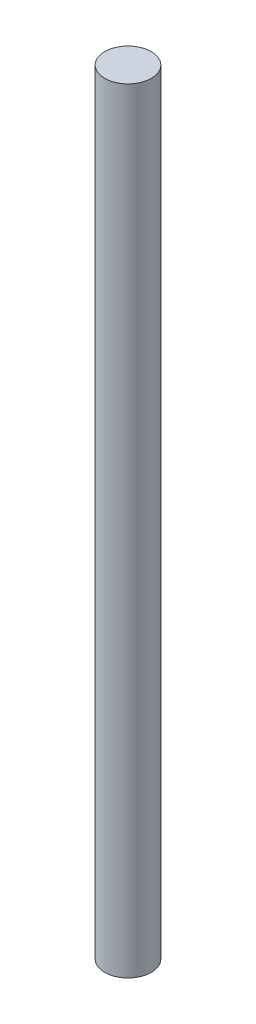
ISO-10303-21;
HEADER;
FILE_DESCRIPTION(('STEP AP214'),'2;1');
FILE_NAME('part.step','',(''),(''),'','','');
FILE_SCHEMA(('AUTOMOTIVE_DESIGN { 1 0 10303 214 1 1 1 1 }'));
ENDSEC;
DATA;
#1=APPLICATION_CONTEXT('core data for automotive mechanical design processes');
#2=APPLICATION_PROTOCOL_DEFINITION('international standard','automotive_design',2000,#1);
#3=PRODUCT_CONTEXT('',#1,'mechanical');
#4=PRODUCT('Part','Part','',(#3));
#5=PRODUCT_RELATED_PRODUCT_CATEGORY('part','',(#4));
#6=PRODUCT_DEFINITION_FORMATION('','',#4);
#7=PRODUCT_DEFINITION_CONTEXT('part definition',#1,'design');
#8=PRODUCT_DEFINITION('design','',#6,#7);
#9=PRODUCT_DEFINITION_SHAPE('','',#8);
#10=(LENGTH_UNIT() NAMED_UNIT(*) SI_UNIT(.MILLI.,.METRE.));
#11=(NAMED_UNIT(*) PLANE_ANGLE_UNIT() SI_UNIT($,.RADIAN.));
#12=(NAMED_UNIT(*) SI_UNIT($,.STERADIAN.) SOLID_ANGLE_UNIT());
#13=UNCERTAINTY_MEASURE_WITH_UNIT(LENGTH_MEASURE(1.E-05),#10,'distance_accuracy_value','');
#14=(GEOMETRIC_REPRESENTATION_CONTEXT(3) GLOBAL_UNCERTAINTY_ASSIGNED_CONTEXT((#13)) GLOBAL_UNIT_ASSIGNED_CONTEXT((#10,
#11,#12)) REPRESENTATION_CONTEXT('',''));
#15=CARTESIAN_POINT('',(0.,0.,0.));
#16=DIRECTION('',(0.,0.,1.));
#17=DIRECTION('',(1.,0.,0.));
#18=AXIS2_PLACEMENT_3D('',#15,#16,#17);
#19=CARTESIAN_POINT('',(0.,200.,0.));
#20=DIRECTION('',(0.,-1.,0.));
#21=DIRECTION('',(0.,0.,-1.));
#22=AXIS2_PLACEMENT_3D('',#19,#20,#21);
#23=CYLINDRICAL_SURFACE('',#22,6.);
#24=CARTESIAN_POINT('',(0.,200.,0.));
#25=DIRECTION('',(0.,1.,0.));
#26=DIRECTION('',(0.,0.,1.));
#27=AXIS2_PLACEMENT_3D('',#24,#25,#26);
#28=CIRCLE('',#27,6.);
#29=CARTESIAN_POINT('',(0.,200.,6.));
#30=VERTEX_POINT('',#29);
#31=EDGE_CURVE('E10',#30,#30,#28,.T.);
#32=ORIENTED_EDGE('',*,*,#31,.F.);
#33=EDGE_LOOP('',(#32));
#34=FACE_BOUND('',#33,.T.);
#35=CARTESIAN_POINT('',(0.,0.,0.));
#36=DIRECTION('',(0.,1.,0.));
#37=DIRECTION('',(0.,0.,1.));
#38=AXIS2_PLACEMENT_3D('',#35,#36,#37);
#39=CIRCLE('',#38,6.);
#40=CARTESIAN_POINT('',(0.,0.,6.));
#41=VERTEX_POINT('',#40);
#42=EDGE_CURVE('E36',#41,#41,#39,.T.);
#43=ORIENTED_EDGE('',*,*,#42,.T.);
#44=EDGE_LOOP('',(#43));
#45=FACE_BOUND('',#44,.T.);
#46=ADVANCED_FACE('F33',(#34,#45),#23,.T.);
#47=CARTESIAN_POINT('',(0.,200.,0.));
#48=DIRECTION('',(0.,1.,0.));
#49=DIRECTION('',(0.,0.,1.));
#50=AXIS2_PLACEMENT_3D('',#47,#48,#49);
#51=PLANE('',#50);
#52=ORIENTED_EDGE('',*,*,#31,.T.);
#53=EDGE_LOOP('',(#52));
#54=FACE_BOUND('',#53,.T.);
#55=ADVANCED_FACE('F48',(#54),#51,.T.);
#56=CARTESIAN_POINT('',(0.,0.,0.));
#57=DIRECTION('',(0.,1.,0.));
#58=DIRECTION('',(0.,0.,1.));
#59=AXIS2_PLACEMENT_3D('',#56,#57,#58);
#60=PLANE('',#59);
#61=ORIENTED_EDGE('',*,*,#42,.F.);
#62=EDGE_LOOP('',(#61));
#63=FACE_BOUND('',#62,.T.);
#64=ADVANCED_FACE('F46',(#63),#60,.F.);
#65=CLOSED_SHELL('',(#46,#55,#64));
#66=MANIFOLD_SOLID_BREP('B2',#65);
#67=ADVANCED_BREP_SHAPE_REPRESENTATION('',(#18,#66),#14);
#68=SHAPE_DEFINITION_REPRESENTATION(#9,#67);
ENDSEC;
END-ISO-10303-21;
